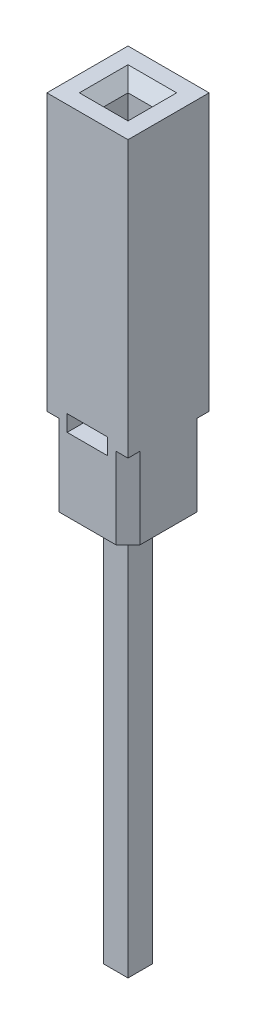
ISO-10303-21;
HEADER;
FILE_DESCRIPTION(('STEP AP214'),'2;1');
FILE_NAME('part.step','',(''),(''),'','','');
FILE_SCHEMA(('AUTOMOTIVE_DESIGN { 1 0 10303 214 1 1 1 1 }'));
ENDSEC;
DATA;
#1=APPLICATION_CONTEXT('core data for automotive mechanical design processes');
#2=APPLICATION_PROTOCOL_DEFINITION('international standard','automotive_design',2000,#1);
#3=PRODUCT_CONTEXT('',#1,'mechanical');
#4=PRODUCT('Part','Part','',(#3));
#5=PRODUCT_RELATED_PRODUCT_CATEGORY('part','',(#4));
#6=PRODUCT_DEFINITION_FORMATION('','',#4);
#7=PRODUCT_DEFINITION_CONTEXT('part definition',#1,'design');
#8=PRODUCT_DEFINITION('design','',#6,#7);
#9=PRODUCT_DEFINITION_SHAPE('','',#8);
#10=(LENGTH_UNIT() NAMED_UNIT(*) SI_UNIT(.MILLI.,.METRE.));
#11=(NAMED_UNIT(*) PLANE_ANGLE_UNIT() SI_UNIT($,.RADIAN.));
#12=(NAMED_UNIT(*) SI_UNIT($,.STERADIAN.) SOLID_ANGLE_UNIT());
#13=UNCERTAINTY_MEASURE_WITH_UNIT(LENGTH_MEASURE(1.E-05),#10,'distance_accuracy_value','');
#14=(GEOMETRIC_REPRESENTATION_CONTEXT(3) GLOBAL_UNCERTAINTY_ASSIGNED_CONTEXT((#13)) GLOBAL_UNIT_ASSIGNED_CONTEXT((#10,
#11,#12)) REPRESENTATION_CONTEXT('',''));
#15=CARTESIAN_POINT('',(0.,0.,0.));
#16=DIRECTION('',(0.,0.,1.));
#17=DIRECTION('',(1.,0.,0.));
#18=AXIS2_PLACEMENT_3D('',#15,#16,#17);
#19=CARTESIAN_POINT('',(0.,-0.254,0.));
#20=DIRECTION('',(0.,-1.,0.));
#21=DIRECTION('',(0.,0.,-1.));
#22=AXIS2_PLACEMENT_3D('',#19,#20,#21);
#23=PLANE('',#22);
#24=DIRECTION('',(0.,0.,1.));
#25=VECTOR('',#24,1.);
#26=CARTESIAN_POINT('',(0.381,-0.254,0.381));
#27=LINE('',#26,#25);
#28=CARTESIAN_POINT('',(0.381,-0.254,-0.381));
#29=VERTEX_POINT('',#28);
#30=CARTESIAN_POINT('',(0.381,-0.254,0.381));
#31=VERTEX_POINT('',#30);
#32=EDGE_CURVE('E327',#29,#31,#27,.T.);
#33=ORIENTED_EDGE('',*,*,#32,.F.);
#34=CARTESIAN_POINT('',(0.,-0.254,0.));
#35=DIRECTION('',(0.,-1.,0.));
#36=DIRECTION('',(0.,0.,-1.));
#37=AXIS2_PLACEMENT_3D('',#34,#35,#36);
#38=CIRCLE('',#37,0.538815367264149);
#39=EDGE_CURVE('E349',#29,#31,#38,.T.);
#40=ORIENTED_EDGE('',*,*,#39,.T.);
#41=EDGE_LOOP('',(#33,#40));
#42=FACE_BOUND('',#41,.T.);
#43=ADVANCED_FACE('F32',(#42),#23,.T.);
#44=DIRECTION('',(1.,0.,0.));
#45=VECTOR('',#44,1.);
#46=CARTESIAN_POINT('',(0.381,-0.254,-0.381));
#47=LINE('',#46,#45);
#48=CARTESIAN_POINT('',(-0.381,-0.254,-0.381));
#49=VERTEX_POINT('',#48);
#50=EDGE_CURVE('E337',#49,#29,#47,.T.);
#51=ORIENTED_EDGE('',*,*,#50,.F.);
#52=EDGE_CURVE('E348',#49,#29,#38,.T.);
#53=ORIENTED_EDGE('',*,*,#52,.T.);
#54=EDGE_LOOP('',(#51,#53));
#55=FACE_BOUND('',#54,.T.);
#56=ADVANCED_FACE('F517',(#55),#23,.T.);
#57=DIRECTION('',(0.,0.,-1.));
#58=VECTOR('',#57,1.);
#59=CARTESIAN_POINT('',(-0.381,-0.254,-0.381));
#60=LINE('',#59,#58);
#61=CARTESIAN_POINT('',(-0.381,-0.254,0.381));
#62=VERTEX_POINT('',#61);
#63=EDGE_CURVE('E334',#62,#49,#60,.T.);
#64=ORIENTED_EDGE('',*,*,#63,.F.);
#65=EDGE_CURVE('E554',#62,#49,#38,.T.);
#66=ORIENTED_EDGE('',*,*,#65,.T.);
#67=EDGE_LOOP('',(#64,#66));
#68=FACE_BOUND('',#67,.T.);
#69=ADVANCED_FACE('F524',(#68),#23,.T.);
#70=CARTESIAN_POINT('',(0.635,2.794,-1.27));
#71=DIRECTION('',(0.,-1.,0.));
#72=DIRECTION('',(0.,0.,-1.));
#73=AXIS2_PLACEMENT_3D('',#70,#71,#72);
#74=PLANE('',#73);
#75=DIRECTION('',(0.,0.,1.));
#76=VECTOR('',#75,1.);
#77=CARTESIAN_POINT('',(-0.635,2.794,1.27));
#78=LINE('',#77,#76);
#79=CARTESIAN_POINT('',(-0.635,2.794,-1.27));
#80=VERTEX_POINT('',#79);
#81=CARTESIAN_POINT('',(-0.635,2.794,1.27));
#82=VERTEX_POINT('',#81);
#83=EDGE_CURVE('E422',#80,#82,#78,.T.);
#84=ORIENTED_EDGE('',*,*,#83,.F.);
#85=DIRECTION('',(-1.,0.,0.));
#86=VECTOR('',#85,1.);
#87=CARTESIAN_POINT('',(0.635,2.794,-1.27));
#88=LINE('',#87,#86);
#89=CARTESIAN_POINT('',(0.635000000000002,2.794,-1.27));
#90=VERTEX_POINT('',#89);
#91=EDGE_CURVE('E783',#90,#80,#88,.T.);
#92=ORIENTED_EDGE('',*,*,#91,.F.);
#93=DIRECTION('',(0.,0.,1.));
#94=VECTOR('',#93,1.);
#95=CARTESIAN_POINT('',(0.635,2.794,-1.27));
#96=LINE('',#95,#94);
#97=CARTESIAN_POINT('',(0.635000000000002,2.794,1.27));
#98=VERTEX_POINT('',#97);
#99=EDGE_CURVE('E804',#90,#98,#96,.T.);
#100=ORIENTED_EDGE('',*,*,#99,.T.);
#101=DIRECTION('',(-1.,0.,0.));
#102=VECTOR('',#101,1.);
#103=CARTESIAN_POINT('',(0.635,2.794,1.27));
#104=LINE('',#103,#102);
#105=EDGE_CURVE('E781',#98,#82,#104,.T.);
#106=ORIENTED_EDGE('',*,*,#105,.T.);
#107=EDGE_LOOP('',(#84,#92,#100,#106));
#108=FACE_BOUND('',#107,.T.);
#109=DIRECTION('',(-1.,0.,0.));
#110=VECTOR('',#109,1.);
#111=CARTESIAN_POINT('',(-0.381,2.794,0.381));
#112=LINE('',#111,#110);
#113=CARTESIAN_POINT('',(0.381,2.794,0.381));
#114=VERTEX_POINT('',#113);
#115=CARTESIAN_POINT('',(-0.381,2.794,0.381));
#116=VERTEX_POINT('',#115);
#117=EDGE_CURVE('E407',#114,#116,#112,.T.);
#118=ORIENTED_EDGE('',*,*,#117,.F.);
#119=DIRECTION('',(0.,0.,1.));
#120=VECTOR('',#119,1.);
#121=CARTESIAN_POINT('',(0.381,2.794,0.381));
#122=LINE('',#121,#120);
#123=CARTESIAN_POINT('',(0.381,2.794,-0.381));
#124=VERTEX_POINT('',#123);
#125=EDGE_CURVE('E380',#124,#114,#122,.T.);
#126=ORIENTED_EDGE('',*,*,#125,.F.);
#127=DIRECTION('',(1.,0.,0.));
#128=VECTOR('',#127,1.);
#129=CARTESIAN_POINT('',(0.381,2.794,-0.381));
#130=LINE('',#129,#128);
#131=CARTESIAN_POINT('',(-0.381,2.794,-0.381));
#132=VERTEX_POINT('',#131);
#133=EDGE_CURVE('E395',#132,#124,#130,.T.);
#134=ORIENTED_EDGE('',*,*,#133,.F.);
#135=DIRECTION('',(0.,0.,-1.));
#136=VECTOR('',#135,1.);
#137=CARTESIAN_POINT('',(-0.381,2.794,-0.381));
#138=LINE('',#137,#136);
#139=EDGE_CURVE('E409',#116,#132,#138,.T.);
#140=ORIENTED_EDGE('',*,*,#139,.F.);
#141=EDGE_LOOP('',(#118,#126,#134,#140));
#142=FACE_BOUND('',#141,.T.);
#143=ADVANCED_FACE('F543',(#108,#142),#74,.T.);
#144=CARTESIAN_POINT('',(0.635,11.176,-1.27));
#145=DIRECTION('',(0.,0.,-1.));
#146=DIRECTION('',(0.,1.,0.));
#147=AXIS2_PLACEMENT_3D('',#144,#145,#146);
#148=PLANE('',#147);
#149=DIRECTION('',(0.,-1.,0.));
#150=VECTOR('',#149,1.);
#151=CARTESIAN_POINT('',(0.888999999999993,2.54,-1.27));
#152=LINE('',#151,#150);
#153=CARTESIAN_POINT('',(0.888999999999993,2.54,-1.27));
#154=VERTEX_POINT('',#153);
#155=CARTESIAN_POINT('',(0.888999999999993,0.,-1.27));
#156=VERTEX_POINT('',#155);
#157=EDGE_CURVE('E282',#154,#156,#152,.T.);
#158=ORIENTED_EDGE('',*,*,#157,.T.);
#159=DIRECTION('',(1.,0.,0.));
#160=VECTOR('',#159,1.);
#161=CARTESIAN_POINT('',(0.635000000000002,0.,-1.27));
#162=LINE('',#161,#160);
#163=CARTESIAN_POINT('',(-0.889000000000007,0.,-1.27));
#164=VERTEX_POINT('',#163);
#165=EDGE_CURVE('E377',#164,#156,#162,.T.);
#166=ORIENTED_EDGE('',*,*,#165,.F.);
#167=DIRECTION('',(0.,-1.,0.));
#168=VECTOR('',#167,1.);
#169=CARTESIAN_POINT('',(-0.889000000000007,2.54,-1.27));
#170=LINE('',#169,#168);
#171=CARTESIAN_POINT('',(-0.889000000000007,2.54,-1.27));
#172=VERTEX_POINT('',#171);
#173=EDGE_CURVE('E307',#172,#164,#170,.T.);
#174=ORIENTED_EDGE('',*,*,#173,.F.);
#175=DIRECTION('',(1.,0.,0.));
#176=VECTOR('',#175,1.);
#177=CARTESIAN_POINT('',(-1.27,2.54,-1.27));
#178=LINE('',#177,#176);
#179=CARTESIAN_POINT('',(-1.27,2.54,-1.27));
#180=VERTEX_POINT('',#179);
#181=EDGE_CURVE('E302',#180,#172,#178,.T.);
#182=ORIENTED_EDGE('',*,*,#181,.F.);
#183=DIRECTION('',(0.,-1.,0.));
#184=VECTOR('',#183,1.);
#185=CARTESIAN_POINT('',(-1.27,11.176,-1.27));
#186=LINE('',#185,#184);
#187=CARTESIAN_POINT('',(-1.27,11.176,-1.27));
#188=VERTEX_POINT('',#187);
#189=EDGE_CURVE('E773',#188,#180,#186,.T.);
#190=ORIENTED_EDGE('',*,*,#189,.F.);
#191=DIRECTION('',(-1.,0.,0.));
#192=VECTOR('',#191,1.);
#193=CARTESIAN_POINT('',(0.635,11.176,-1.27));
#194=LINE('',#193,#192);
#195=CARTESIAN_POINT('',(1.27,11.176,-1.27));
#196=VERTEX_POINT('',#195);
#197=EDGE_CURVE('E439',#196,#188,#194,.T.);
#198=ORIENTED_EDGE('',*,*,#197,.F.);
#199=DIRECTION('',(0.,1.,0.));
#200=VECTOR('',#199,1.);
#201=CARTESIAN_POINT('',(1.27,11.176,-1.27));
#202=LINE('',#201,#200);
#203=CARTESIAN_POINT('',(1.27,2.54,-1.27));
#204=VERTEX_POINT('',#203);
#205=EDGE_CURVE('E354',#204,#196,#202,.T.);
#206=ORIENTED_EDGE('',*,*,#205,.F.);
#207=DIRECTION('',(1.,0.,0.));
#208=VECTOR('',#207,1.);
#209=CARTESIAN_POINT('',(0.888999999999993,2.54,-1.27));
#210=LINE('',#209,#208);
#211=EDGE_CURVE('E273',#154,#204,#210,.T.);
#212=ORIENTED_EDGE('',*,*,#211,.F.);
#213=EDGE_LOOP('',(#158,#166,#174,#182,#190,#198,#206,#212));
#214=FACE_BOUND('',#213,.T.);
#215=DIRECTION('',(0.,1.,0.));
#216=VECTOR('',#215,1.);
#217=CARTESIAN_POINT('',(0.635000000000002,11.176,-1.27));
#218=LINE('',#217,#216);
#219=CARTESIAN_POINT('',(0.635000000000002,2.286,-1.27));
#220=VERTEX_POINT('',#219);
#221=EDGE_CURVE('E352',#220,#90,#218,.T.);
#222=ORIENTED_EDGE('',*,*,#221,.T.);
#223=ORIENTED_EDGE('',*,*,#91,.T.);
#224=DIRECTION('',(0.,1.,0.));
#225=VECTOR('',#224,1.);
#226=CARTESIAN_POINT('',(-0.635,2.286,-1.27));
#227=LINE('',#226,#225);
#228=CARTESIAN_POINT('',(-0.635,2.286,-1.27));
#229=VERTEX_POINT('',#228);
#230=EDGE_CURVE('E796',#229,#80,#227,.T.);
#231=ORIENTED_EDGE('',*,*,#230,.F.);
#232=DIRECTION('',(1.,0.,0.));
#233=VECTOR('',#232,1.);
#234=CARTESIAN_POINT('',(0.635000000000002,2.286,-1.27));
#235=LINE('',#234,#233);
#236=EDGE_CURVE('E388',#229,#220,#235,.T.);
#237=ORIENTED_EDGE('',*,*,#236,.T.);
#238=EDGE_LOOP('',(#222,#223,#231,#237));
#239=FACE_BOUND('',#238,.T.);
#240=ADVANCED_FACE('F548',(#214,#239),#148,.T.);
#241=CARTESIAN_POINT('',(0.635,11.176,1.27));
#242=DIRECTION('',(0.,1.,0.));
#243=DIRECTION('',(0.,0.,1.));
#244=AXIS2_PLACEMENT_3D('',#241,#242,#243);
#245=PLANE('',#244);
#246=DIRECTION('',(-1.,0.,0.));
#247=VECTOR('',#246,1.);
#248=CARTESIAN_POINT('',(-0.381,11.176,0.762000000000003));
#249=LINE('',#248,#247);
#250=CARTESIAN_POINT('',(0.762000000000003,11.176,0.762000000000003));
#251=VERTEX_POINT('',#250);
#252=CARTESIAN_POINT('',(-0.762000000000003,11.176,0.762000000000003));
#253=VERTEX_POINT('',#252);
#254=EDGE_CURVE('E468',#251,#253,#249,.T.);
#255=ORIENTED_EDGE('',*,*,#254,.T.);
#256=DIRECTION('',(0.,0.,-1.));
#257=VECTOR('',#256,1.);
#258=CARTESIAN_POINT('',(-0.762000000000003,11.176,-0.381));
#259=LINE('',#258,#257);
#260=CARTESIAN_POINT('',(-0.762000000000003,11.176,-0.762000000000003));
#261=VERTEX_POINT('',#260);
#262=EDGE_CURVE('E472',#253,#261,#259,.T.);
#263=ORIENTED_EDGE('',*,*,#262,.T.);
#264=DIRECTION('',(1.,0.,0.));
#265=VECTOR('',#264,1.);
#266=CARTESIAN_POINT('',(0.381,11.176,-0.762000000000003));
#267=LINE('',#266,#265);
#268=CARTESIAN_POINT('',(0.762000000000003,11.176,-0.762000000000003));
#269=VERTEX_POINT('',#268);
#270=EDGE_CURVE('E470',#261,#269,#267,.T.);
#271=ORIENTED_EDGE('',*,*,#270,.T.);
#272=DIRECTION('',(0.,0.,1.));
#273=VECTOR('',#272,1.);
#274=CARTESIAN_POINT('',(0.762000000000003,11.176,0.381));
#275=LINE('',#274,#273);
#276=EDGE_CURVE('E466',#269,#251,#275,.T.);
#277=ORIENTED_EDGE('',*,*,#276,.T.);
#278=EDGE_LOOP('',(#255,#263,#271,#277));
#279=FACE_BOUND('',#278,.T.);
#280=DIRECTION('',(0.,0.,-1.));
#281=VECTOR('',#280,1.);
#282=CARTESIAN_POINT('',(-1.27,11.176,1.27));
#283=LINE('',#282,#281);
#284=CARTESIAN_POINT('',(-1.27,11.176,1.27));
#285=VERTEX_POINT('',#284);
#286=EDGE_CURVE('E779',#285,#188,#283,.T.);
#287=ORIENTED_EDGE('',*,*,#286,.F.);
#288=DIRECTION('',(-1.,0.,0.));
#289=VECTOR('',#288,1.);
#290=CARTESIAN_POINT('',(0.635,11.176,1.27));
#291=LINE('',#290,#289);
#292=CARTESIAN_POINT('',(1.27,11.176,1.27));
#293=VERTEX_POINT('',#292);
#294=EDGE_CURVE('E776',#293,#285,#291,.T.);
#295=ORIENTED_EDGE('',*,*,#294,.F.);
#296=DIRECTION('',(0.,0.,1.));
#297=VECTOR('',#296,1.);
#298=CARTESIAN_POINT('',(1.27,11.176,1.27));
#299=LINE('',#298,#297);
#300=EDGE_CURVE('E356',#196,#293,#299,.T.);
#301=ORIENTED_EDGE('',*,*,#300,.F.);
#302=ORIENTED_EDGE('',*,*,#197,.T.);
#303=EDGE_LOOP('',(#287,#295,#301,#302));
#304=FACE_BOUND('',#303,.T.);
#305=ADVANCED_FACE('F496',(#279,#304),#245,.T.);
#306=CARTESIAN_POINT('',(0.635,2.794,1.27));
#307=DIRECTION('',(0.,0.,1.));
#308=DIRECTION('',(1.,0.,0.));
#309=AXIS2_PLACEMENT_3D('',#306,#307,#308);
#310=PLANE('',#309);
#311=DIRECTION('',(0.,-1.,0.));
#312=VECTOR('',#311,1.);
#313=CARTESIAN_POINT('',(0.889000000000002,2.54,1.27));
#314=LINE('',#313,#312);
#315=CARTESIAN_POINT('',(0.889000000000002,2.54,1.27));
#316=VERTEX_POINT('',#315);
#317=CARTESIAN_POINT('',(0.889000000000002,0.,1.27));
#318=VERTEX_POINT('',#317);
#319=EDGE_CURVE('E293',#316,#318,#314,.T.);
#320=ORIENTED_EDGE('',*,*,#319,.F.);
#321=DIRECTION('',(-1.,0.,0.));
#322=VECTOR('',#321,1.);
#323=CARTESIAN_POINT('',(1.27,2.54,1.27));
#324=LINE('',#323,#322);
#325=CARTESIAN_POINT('',(1.27,2.54,1.27));
#326=VERTEX_POINT('',#325);
#327=EDGE_CURVE('E289',#326,#316,#324,.T.);
#328=ORIENTED_EDGE('',*,*,#327,.F.);
#329=DIRECTION('',(0.,-1.,0.));
#330=VECTOR('',#329,1.);
#331=CARTESIAN_POINT('',(1.27,0.,1.27));
#332=LINE('',#331,#330);
#333=EDGE_CURVE('E360',#293,#326,#332,.T.);
#334=ORIENTED_EDGE('',*,*,#333,.F.);
#335=ORIENTED_EDGE('',*,*,#294,.T.);
#336=DIRECTION('',(0.,1.,0.));
#337=VECTOR('',#336,1.);
#338=CARTESIAN_POINT('',(-1.27,2.794,1.27));
#339=LINE('',#338,#337);
#340=CARTESIAN_POINT('',(-1.27,2.54,1.27));
#341=VERTEX_POINT('',#340);
#342=EDGE_CURVE('E800',#341,#285,#339,.T.);
#343=ORIENTED_EDGE('',*,*,#342,.F.);
#344=DIRECTION('',(-1.,0.,0.));
#345=VECTOR('',#344,1.);
#346=CARTESIAN_POINT('',(-0.889,2.54,1.27));
#347=LINE('',#346,#345);
#348=CARTESIAN_POINT('',(-0.889,2.54,1.27));
#349=VERTEX_POINT('',#348);
#350=EDGE_CURVE('E314',#349,#341,#347,.T.);
#351=ORIENTED_EDGE('',*,*,#350,.F.);
#352=DIRECTION('',(0.,-1.,0.));
#353=VECTOR('',#352,1.);
#354=CARTESIAN_POINT('',(-0.889,2.54,1.27));
#355=LINE('',#354,#353);
#356=CARTESIAN_POINT('',(-0.889,0.,1.27));
#357=VERTEX_POINT('',#356);
#358=EDGE_CURVE('E324',#349,#357,#355,.T.);
#359=ORIENTED_EDGE('',*,*,#358,.T.);
#360=DIRECTION('',(-1.,0.,0.));
#361=VECTOR('',#360,1.);
#362=CARTESIAN_POINT('',(-1.27,0.,1.27));
#363=LINE('',#362,#361);
#364=EDGE_CURVE('E371',#318,#357,#363,.T.);
#365=ORIENTED_EDGE('',*,*,#364,.F.);
#366=EDGE_LOOP('',(#320,#328,#334,#335,#343,#351,#359,#365));
#367=FACE_BOUND('',#366,.T.);
#368=ORIENTED_EDGE('',*,*,#105,.F.);
#369=DIRECTION('',(0.,-1.,0.));
#370=VECTOR('',#369,1.);
#371=CARTESIAN_POINT('',(0.635000000000002,0.,1.27));
#372=LINE('',#371,#370);
#373=CARTESIAN_POINT('',(0.635000000000002,2.286,1.27));
#374=VERTEX_POINT('',#373);
#375=EDGE_CURVE('E357',#98,#374,#372,.T.);
#376=ORIENTED_EDGE('',*,*,#375,.T.);
#377=DIRECTION('',(-1.,0.,0.));
#378=VECTOR('',#377,1.);
#379=CARTESIAN_POINT('',(-1.27,2.286,1.27));
#380=LINE('',#379,#378);
#381=CARTESIAN_POINT('',(-0.635,2.286,1.27));
#382=VERTEX_POINT('',#381);
#383=EDGE_CURVE('E366',#374,#382,#380,.T.);
#384=ORIENTED_EDGE('',*,*,#383,.T.);
#385=DIRECTION('',(0.,1.,0.));
#386=VECTOR('',#385,1.);
#387=CARTESIAN_POINT('',(-0.635,2.286,1.27));
#388=LINE('',#387,#386);
#389=EDGE_CURVE('E432',#382,#82,#388,.T.);
#390=ORIENTED_EDGE('',*,*,#389,.T.);
#391=EDGE_LOOP('',(#368,#376,#384,#390));
#392=FACE_BOUND('',#391,.T.);
#393=ADVANCED_FACE('F705',(#367,#392),#310,.T.);
#394=CARTESIAN_POINT('',(-1.27,0.,0.));
#395=DIRECTION('',(-1.,0.,0.));
#396=DIRECTION('',(0.,0.,1.));
#397=AXIS2_PLACEMENT_3D('',#394,#395,#396);
#398=PLANE('',#397);
#399=DIRECTION('',(0.,-1.,0.));
#400=VECTOR('',#399,1.);
#401=CARTESIAN_POINT('',(-1.27,2.54,-0.888999999999987));
#402=LINE('',#401,#400);
#403=CARTESIAN_POINT('',(-1.27,2.54,-0.888999999999987));
#404=VERTEX_POINT('',#403);
#405=CARTESIAN_POINT('',(-1.27,0.,-0.888999999999987));
#406=VERTEX_POINT('',#405);
#407=EDGE_CURVE('E309',#404,#406,#402,.T.);
#408=ORIENTED_EDGE('',*,*,#407,.T.);
#409=DIRECTION('',(0.,0.,-1.));
#410=VECTOR('',#409,1.);
#411=CARTESIAN_POINT('',(-1.27,0.,-1.27));
#412=LINE('',#411,#410);
#413=CARTESIAN_POINT('',(-1.27,0.,0.889));
#414=VERTEX_POINT('',#413);
#415=EDGE_CURVE('E373',#414,#406,#412,.T.);
#416=ORIENTED_EDGE('',*,*,#415,.F.);
#417=DIRECTION('',(0.,-1.,0.));
#418=VECTOR('',#417,1.);
#419=CARTESIAN_POINT('',(-1.27,2.54,0.889));
#420=LINE('',#419,#418);
#421=CARTESIAN_POINT('',(-1.27,2.54,0.889));
#422=VERTEX_POINT('',#421);
#423=EDGE_CURVE('E321',#422,#414,#420,.T.);
#424=ORIENTED_EDGE('',*,*,#423,.F.);
#425=DIRECTION('',(0.,0.,-1.));
#426=VECTOR('',#425,1.);
#427=CARTESIAN_POINT('',(-1.27,2.54,1.27));
#428=LINE('',#427,#426);
#429=EDGE_CURVE('E316',#341,#422,#428,.T.);
#430=ORIENTED_EDGE('',*,*,#429,.F.);
#431=ORIENTED_EDGE('',*,*,#342,.T.);
#432=ORIENTED_EDGE('',*,*,#286,.T.);
#433=ORIENTED_EDGE('',*,*,#189,.T.);
#434=DIRECTION('',(0.,0.,-1.));
#435=VECTOR('',#434,1.);
#436=CARTESIAN_POINT('',(-1.27,2.54,-0.888999999999987));
#437=LINE('',#436,#435);
#438=EDGE_CURVE('E300',#404,#180,#437,.T.);
#439=ORIENTED_EDGE('',*,*,#438,.F.);
#440=EDGE_LOOP('',(#408,#416,#424,#430,#431,#432,#433,#439));
#441=FACE_BOUND('',#440,.T.);
#442=ADVANCED_FACE('F708',(#441),#398,.T.);
#443=CARTESIAN_POINT('',(-0.635,2.286,1.27));
#444=DIRECTION('',(-1.,0.,0.));
#445=DIRECTION('',(0.,0.,1.));
#446=AXIS2_PLACEMENT_3D('',#443,#444,#445);
#447=PLANE('',#446);
#448=ORIENTED_EDGE('',*,*,#83,.T.);
#449=ORIENTED_EDGE('',*,*,#389,.F.);
#450=DIRECTION('',(0.,0.,1.));
#451=VECTOR('',#450,1.);
#452=CARTESIAN_POINT('',(-0.635,2.286,1.27));
#453=LINE('',#452,#451);
#454=EDGE_CURVE('E428',#229,#382,#453,.T.);
#455=ORIENTED_EDGE('',*,*,#454,.F.);
#456=ORIENTED_EDGE('',*,*,#230,.T.);
#457=EDGE_LOOP('',(#448,#449,#455,#456));
#458=FACE_BOUND('',#457,.T.);
#459=ADVANCED_FACE('F714',(#458),#447,.F.);
#460=CARTESIAN_POINT('',(0.381,2.286,0.381));
#461=DIRECTION('',(-1.,0.,0.));
#462=DIRECTION('',(0.,0.,1.));
#463=AXIS2_PLACEMENT_3D('',#460,#461,#462);
#464=PLANE('',#463);
#465=ORIENTED_EDGE('',*,*,#125,.T.);
#466=DIRECTION('',(0.,1.,0.));
#467=VECTOR('',#466,1.);
#468=CARTESIAN_POINT('',(0.381,2.286,0.381));
#469=LINE('',#468,#467);
#470=CARTESIAN_POINT('',(0.381,2.286,0.381));
#471=VERTEX_POINT('',#470);
#472=EDGE_CURVE('E420',#471,#114,#469,.T.);
#473=ORIENTED_EDGE('',*,*,#472,.F.);
#474=DIRECTION('',(0.,0.,1.));
#475=VECTOR('',#474,1.);
#476=CARTESIAN_POINT('',(0.381,2.286,0.381));
#477=LINE('',#476,#475);
#478=CARTESIAN_POINT('',(0.381,2.286,-0.381));
#479=VERTEX_POINT('',#478);
#480=EDGE_CURVE('E391',#479,#471,#477,.T.);
#481=ORIENTED_EDGE('',*,*,#480,.F.);
#482=DIRECTION('',(0.,1.,0.));
#483=VECTOR('',#482,1.);
#484=CARTESIAN_POINT('',(0.381,2.286,-0.381));
#485=LINE('',#484,#483);
#486=EDGE_CURVE('E404',#479,#124,#485,.T.);
#487=ORIENTED_EDGE('',*,*,#486,.T.);
#488=EDGE_LOOP('',(#465,#473,#481,#487));
#489=FACE_BOUND('',#488,.T.);
#490=ADVANCED_FACE('F718',(#489),#464,.F.);
#491=CARTESIAN_POINT('',(-0.381,2.286,0.381));
#492=DIRECTION('',(0.,0.,-1.));
#493=DIRECTION('',(-1.,0.,0.));
#494=AXIS2_PLACEMENT_3D('',#491,#492,#493);
#495=PLANE('',#494);
#496=ORIENTED_EDGE('',*,*,#117,.T.);
#497=DIRECTION('',(0.,1.,0.));
#498=VECTOR('',#497,1.);
#499=CARTESIAN_POINT('',(-0.381,2.286,0.381));
#500=LINE('',#499,#498);
#501=CARTESIAN_POINT('',(-0.381,2.286,0.381));
#502=VERTEX_POINT('',#501);
#503=EDGE_CURVE('E417',#502,#116,#500,.T.);
#504=ORIENTED_EDGE('',*,*,#503,.F.);
#505=DIRECTION('',(-1.,0.,0.));
#506=VECTOR('',#505,1.);
#507=CARTESIAN_POINT('',(-0.381,2.286,0.381));
#508=LINE('',#507,#506);
#509=EDGE_CURVE('E394',#471,#502,#508,.T.);
#510=ORIENTED_EDGE('',*,*,#509,.F.);
#511=ORIENTED_EDGE('',*,*,#472,.T.);
#512=EDGE_LOOP('',(#496,#504,#510,#511));
#513=FACE_BOUND('',#512,.T.);
#514=ADVANCED_FACE('F722',(#513),#495,.F.);
#515=CARTESIAN_POINT('',(-0.381,2.286,-0.381));
#516=DIRECTION('',(1.,0.,0.));
#517=DIRECTION('',(0.,0.,-1.));
#518=AXIS2_PLACEMENT_3D('',#515,#516,#517);
#519=PLANE('',#518);
#520=ORIENTED_EDGE('',*,*,#139,.T.);
#521=DIRECTION('',(0.,1.,0.));
#522=VECTOR('',#521,1.);
#523=CARTESIAN_POINT('',(-0.381,2.286,-0.381));
#524=LINE('',#523,#522);
#525=CARTESIAN_POINT('',(-0.381,2.286,-0.381));
#526=VERTEX_POINT('',#525);
#527=EDGE_CURVE('E415',#526,#132,#524,.T.);
#528=ORIENTED_EDGE('',*,*,#527,.F.);
#529=DIRECTION('',(0.,0.,-1.));
#530=VECTOR('',#529,1.);
#531=CARTESIAN_POINT('',(-0.381,2.286,-0.381));
#532=LINE('',#531,#530);
#533=EDGE_CURVE('E398',#502,#526,#532,.T.);
#534=ORIENTED_EDGE('',*,*,#533,.F.);
#535=ORIENTED_EDGE('',*,*,#503,.T.);
#536=EDGE_LOOP('',(#520,#528,#534,#535));
#537=FACE_BOUND('',#536,.T.);
#538=ADVANCED_FACE('F726',(#537),#519,.F.);
#539=CARTESIAN_POINT('',(0.381,2.286,-0.381));
#540=DIRECTION('',(0.,0.,1.));
#541=DIRECTION('',(1.,0.,0.));
#542=AXIS2_PLACEMENT_3D('',#539,#540,#541);
#543=PLANE('',#542);
#544=ORIENTED_EDGE('',*,*,#133,.T.);
#545=ORIENTED_EDGE('',*,*,#486,.F.);
#546=DIRECTION('',(1.,0.,0.));
#547=VECTOR('',#546,1.);
#548=CARTESIAN_POINT('',(0.381,2.286,-0.381));
#549=LINE('',#548,#547);
#550=EDGE_CURVE('E401',#526,#479,#549,.T.);
#551=ORIENTED_EDGE('',*,*,#550,.F.);
#552=ORIENTED_EDGE('',*,*,#527,.T.);
#553=EDGE_LOOP('',(#544,#545,#551,#552));
#554=FACE_BOUND('',#553,.T.);
#555=ADVANCED_FACE('F730',(#554),#543,.F.);
#556=CARTESIAN_POINT('',(0.,2.286,0.));
#557=DIRECTION('',(0.,1.,0.));
#558=DIRECTION('',(0.,0.,1.));
#559=AXIS2_PLACEMENT_3D('',#556,#557,#558);
#560=PLANE('',#559);
#561=ORIENTED_EDGE('',*,*,#236,.F.);
#562=ORIENTED_EDGE('',*,*,#454,.T.);
#563=ORIENTED_EDGE('',*,*,#383,.F.);
#564=DIRECTION('',(0.,0.,1.));
#565=VECTOR('',#564,1.);
#566=CARTESIAN_POINT('',(0.635000000000002,2.286,1.27));
#567=LINE('',#566,#565);
#568=EDGE_CURVE('E374',#220,#374,#567,.T.);
#569=ORIENTED_EDGE('',*,*,#568,.F.);
#570=EDGE_LOOP('',(#561,#562,#563,#569));
#571=FACE_BOUND('',#570,.T.);
#572=ORIENTED_EDGE('',*,*,#480,.T.);
#573=ORIENTED_EDGE('',*,*,#509,.T.);
#574=ORIENTED_EDGE('',*,*,#533,.T.);
#575=ORIENTED_EDGE('',*,*,#550,.T.);
#576=EDGE_LOOP('',(#572,#573,#574,#575));
#577=FACE_BOUND('',#576,.T.);
#578=ADVANCED_FACE('F734',(#571,#577),#560,.T.);
#579=CARTESIAN_POINT('',(0.,0.,0.));
#580=DIRECTION('',(0.,1.,0.));
#581=DIRECTION('',(0.,0.,1.));
#582=AXIS2_PLACEMENT_3D('',#579,#580,#581);
#583=PLANE('',#582);
#584=CARTESIAN_POINT('',(0.,0.,0.));
#585=DIRECTION('',(0.,1.,0.));
#586=DIRECTION('',(0.,0.,1.));
#587=AXIS2_PLACEMENT_3D('',#584,#585,#586);
#588=CIRCLE('',#587,0.538815367264149);
#589=CARTESIAN_POINT('',(0.,0.,0.538815367264149));
#590=VERTEX_POINT('',#589);
#591=EDGE_CURVE('E435',#590,#590,#588,.F.);
#592=ORIENTED_EDGE('',*,*,#591,.F.);
#593=EDGE_LOOP('',(#592));
#594=FACE_BOUND('',#593,.T.);
#595=ORIENTED_EDGE('',*,*,#165,.T.);
#596=DIRECTION('',(-0.707106781186556,0.,-0.707106781186539));
#597=VECTOR('',#596,1.);
#598=CARTESIAN_POINT('',(1.27,0.,-0.889000000000003));
#599=LINE('',#598,#597);
#600=CARTESIAN_POINT('',(1.27,0.,-0.889000000000003));
#601=VERTEX_POINT('',#600);
#602=EDGE_CURVE('E268',#601,#156,#599,.T.);
#603=ORIENTED_EDGE('',*,*,#602,.F.);
#604=DIRECTION('',(0.,0.,-1.));
#605=VECTOR('',#604,1.);
#606=CARTESIAN_POINT('',(1.27,0.,-1.27));
#607=LINE('',#606,#605);
#608=CARTESIAN_POINT('',(1.27,0.,0.888999999999997));
#609=VERTEX_POINT('',#608);
#610=EDGE_CURVE('E363',#609,#601,#607,.T.);
#611=ORIENTED_EDGE('',*,*,#610,.F.);
#612=DIRECTION('',(0.707106781186544,0.,-0.707106781186551));
#613=VECTOR('',#612,1.);
#614=CARTESIAN_POINT('',(0.889000000000002,0.,1.27));
#615=LINE('',#614,#613);
#616=EDGE_CURVE('E285',#318,#609,#615,.T.);
#617=ORIENTED_EDGE('',*,*,#616,.F.);
#618=ORIENTED_EDGE('',*,*,#364,.T.);
#619=DIRECTION('',(0.707106781186547,0.,0.707106781186547));
#620=VECTOR('',#619,1.);
#621=CARTESIAN_POINT('',(-1.27,0.,0.889));
#622=LINE('',#621,#620);
#623=EDGE_CURVE('E312',#414,#357,#622,.T.);
#624=ORIENTED_EDGE('',*,*,#623,.F.);
#625=ORIENTED_EDGE('',*,*,#415,.T.);
#626=DIRECTION('',(-0.70710678118653,0.,0.707106781186565));
#627=VECTOR('',#626,1.);
#628=CARTESIAN_POINT('',(-0.889000000000007,0.,-1.27));
#629=LINE('',#628,#627);
#630=EDGE_CURVE('E298',#164,#406,#629,.T.);
#631=ORIENTED_EDGE('',*,*,#630,.F.);
#632=EDGE_LOOP('',(#595,#603,#611,#617,#618,#624,#625,#631));
#633=FACE_BOUND('',#632,.T.);
#634=ADVANCED_FACE('F738',(#594,#633),#583,.F.);
#635=CARTESIAN_POINT('',(1.27,0.,0.));
#636=DIRECTION('',(-1.,0.,0.));
#637=DIRECTION('',(0.,0.,1.));
#638=AXIS2_PLACEMENT_3D('',#635,#636,#637);
#639=PLANE('',#638);
#640=ORIENTED_EDGE('',*,*,#610,.T.);
#641=DIRECTION('',(0.,-1.,0.));
#642=VECTOR('',#641,1.);
#643=CARTESIAN_POINT('',(1.27,2.54,-0.889000000000003));
#644=LINE('',#643,#642);
#645=CARTESIAN_POINT('',(1.27,2.54,-0.889000000000003));
#646=VERTEX_POINT('',#645);
#647=EDGE_CURVE('E280',#646,#601,#644,.T.);
#648=ORIENTED_EDGE('',*,*,#647,.F.);
#649=DIRECTION('',(0.,0.,1.));
#650=VECTOR('',#649,1.);
#651=CARTESIAN_POINT('',(1.27,2.54,-1.27));
#652=LINE('',#651,#650);
#653=EDGE_CURVE('E275',#204,#646,#652,.T.);
#654=ORIENTED_EDGE('',*,*,#653,.F.);
#655=ORIENTED_EDGE('',*,*,#205,.T.);
#656=ORIENTED_EDGE('',*,*,#300,.T.);
#657=ORIENTED_EDGE('',*,*,#333,.T.);
#658=DIRECTION('',(0.,0.,1.));
#659=VECTOR('',#658,1.);
#660=CARTESIAN_POINT('',(1.27,2.54,0.888999999999997));
#661=LINE('',#660,#659);
#662=CARTESIAN_POINT('',(1.27,2.54,0.888999999999997));
#663=VERTEX_POINT('',#662);
#664=EDGE_CURVE('E287',#663,#326,#661,.T.);
#665=ORIENTED_EDGE('',*,*,#664,.F.);
#666=DIRECTION('',(0.,-1.,0.));
#667=VECTOR('',#666,1.);
#668=CARTESIAN_POINT('',(1.27,2.54,0.888999999999997));
#669=LINE('',#668,#667);
#670=EDGE_CURVE('E295',#663,#609,#669,.T.);
#671=ORIENTED_EDGE('',*,*,#670,.T.);
#672=EDGE_LOOP('',(#640,#648,#654,#655,#656,#657,#665,#671));
#673=FACE_BOUND('',#672,.T.);
#674=ADVANCED_FACE('F742',(#673),#639,.F.);
#675=CARTESIAN_POINT('',(0.635000000000002,0.,0.));
#676=DIRECTION('',(-1.,0.,0.));
#677=DIRECTION('',(0.,0.,1.));
#678=AXIS2_PLACEMENT_3D('',#675,#676,#677);
#679=PLANE('',#678);
#680=ORIENTED_EDGE('',*,*,#375,.F.);
#681=ORIENTED_EDGE('',*,*,#99,.F.);
#682=ORIENTED_EDGE('',*,*,#221,.F.);
#683=ORIENTED_EDGE('',*,*,#568,.T.);
#684=EDGE_LOOP('',(#680,#681,#682,#683));
#685=FACE_BOUND('',#684,.T.);
#686=ADVANCED_FACE('F539',(#685),#679,.T.);
#687=CARTESIAN_POINT('',(0.,-0.254,0.));
#688=DIRECTION('',(0.,1.,0.));
#689=DIRECTION('',(0.,0.,1.));
#690=AXIS2_PLACEMENT_3D('',#687,#688,#689);
#691=CYLINDRICAL_SURFACE('',#690,0.538815367264149);
#692=ORIENTED_EDGE('',*,*,#39,.F.);
#693=ORIENTED_EDGE('',*,*,#52,.F.);
#694=ORIENTED_EDGE('',*,*,#65,.F.);
#695=EDGE_CURVE('E353',#31,#62,#38,.T.);
#696=ORIENTED_EDGE('',*,*,#695,.F.);
#697=EDGE_LOOP('',(#692,#693,#694,#696));
#698=FACE_BOUND('',#697,.T.);
#699=ORIENTED_EDGE('',*,*,#591,.T.);
#700=EDGE_LOOP('',(#699));
#701=FACE_BOUND('',#700,.T.);
#702=ADVANCED_FACE('F531',(#698,#701),#691,.T.);
#703=DIRECTION('',(-1.,0.,0.));
#704=VECTOR('',#703,1.);
#705=CARTESIAN_POINT('',(-0.381,-0.254,0.381));
#706=LINE('',#705,#704);
#707=EDGE_CURVE('E331',#31,#62,#706,.T.);
#708=ORIENTED_EDGE('',*,*,#707,.F.);
#709=ORIENTED_EDGE('',*,*,#695,.T.);
#710=EDGE_LOOP('',(#708,#709));
#711=FACE_BOUND('',#710,.T.);
#712=ADVANCED_FACE('F520',(#711),#23,.T.);
#713=CARTESIAN_POINT('',(0.381,-12.7,0.381));
#714=DIRECTION('',(-1.,0.,0.));
#715=DIRECTION('',(0.,0.,1.));
#716=AXIS2_PLACEMENT_3D('',#713,#714,#715);
#717=PLANE('',#716);
#718=DIRECTION('',(0.,1.,0.));
#719=VECTOR('',#718,1.);
#720=CARTESIAN_POINT('',(0.381,-12.7,0.381));
#721=LINE('',#720,#719);
#722=CARTESIAN_POINT('',(0.381,-12.446,0.381));
#723=VERTEX_POINT('',#722);
#724=EDGE_CURVE('E346',#723,#31,#721,.T.);
#725=ORIENTED_EDGE('',*,*,#724,.F.);
#726=DIRECTION('',(0.,0.,-1.));
#727=VECTOR('',#726,1.);
#728=CARTESIAN_POINT('',(0.381,-12.446,0.381));
#729=LINE('',#728,#727);
#730=CARTESIAN_POINT('',(0.381,-12.446,-0.381));
#731=VERTEX_POINT('',#730);
#732=EDGE_CURVE('E451',#723,#731,#729,.T.);
#733=ORIENTED_EDGE('',*,*,#732,.T.);
#734=DIRECTION('',(0.,1.,0.));
#735=VECTOR('',#734,1.);
#736=CARTESIAN_POINT('',(0.381,-12.7,-0.381));
#737=LINE('',#736,#735);
#738=EDGE_CURVE('E340',#731,#29,#737,.T.);
#739=ORIENTED_EDGE('',*,*,#738,.T.);
#740=ORIENTED_EDGE('',*,*,#32,.T.);
#741=EDGE_LOOP('',(#725,#733,#739,#740));
#742=FACE_BOUND('',#741,.T.);
#743=ADVANCED_FACE('F530',(#742),#717,.F.);
#744=CARTESIAN_POINT('',(-0.381,-12.7,0.381));
#745=DIRECTION('',(0.,0.,-1.));
#746=DIRECTION('',(-1.,0.,0.));
#747=AXIS2_PLACEMENT_3D('',#744,#745,#746);
#748=PLANE('',#747);
#749=DIRECTION('',(0.,1.,0.));
#750=VECTOR('',#749,1.);
#751=CARTESIAN_POINT('',(-0.381,-12.7,0.381));
#752=LINE('',#751,#750);
#753=CARTESIAN_POINT('',(-0.381,-12.446,0.381));
#754=VERTEX_POINT('',#753);
#755=EDGE_CURVE('E344',#754,#62,#752,.T.);
#756=ORIENTED_EDGE('',*,*,#755,.F.);
#757=DIRECTION('',(1.,0.,0.));
#758=VECTOR('',#757,1.);
#759=CARTESIAN_POINT('',(-0.381,-12.446,0.381));
#760=LINE('',#759,#758);
#761=EDGE_CURVE('E448',#754,#723,#760,.T.);
#762=ORIENTED_EDGE('',*,*,#761,.T.);
#763=ORIENTED_EDGE('',*,*,#724,.T.);
#764=ORIENTED_EDGE('',*,*,#707,.T.);
#765=EDGE_LOOP('',(#756,#762,#763,#764));
#766=FACE_BOUND('',#765,.T.);
#767=ADVANCED_FACE('F537',(#766),#748,.F.);
#768=CARTESIAN_POINT('',(-0.381,-12.7,-0.381));
#769=DIRECTION('',(1.,0.,0.));
#770=DIRECTION('',(0.,0.,-1.));
#771=AXIS2_PLACEMENT_3D('',#768,#769,#770);
#772=PLANE('',#771);
#773=DIRECTION('',(0.,1.,0.));
#774=VECTOR('',#773,1.);
#775=CARTESIAN_POINT('',(-0.381,-12.7,-0.381));
#776=LINE('',#775,#774);
#777=CARTESIAN_POINT('',(-0.381,-12.446,-0.381));
#778=VERTEX_POINT('',#777);
#779=EDGE_CURVE('E342',#778,#49,#776,.T.);
#780=ORIENTED_EDGE('',*,*,#779,.F.);
#781=DIRECTION('',(0.,0.,1.));
#782=VECTOR('',#781,1.);
#783=CARTESIAN_POINT('',(-0.381,-12.446,-0.381));
#784=LINE('',#783,#782);
#785=EDGE_CURVE('E453',#778,#754,#784,.T.);
#786=ORIENTED_EDGE('',*,*,#785,.T.);
#787=ORIENTED_EDGE('',*,*,#755,.T.);
#788=ORIENTED_EDGE('',*,*,#63,.T.);
#789=EDGE_LOOP('',(#780,#786,#787,#788));
#790=FACE_BOUND('',#789,.T.);
#791=ADVANCED_FACE('F590',(#790),#772,.F.);
#792=CARTESIAN_POINT('',(0.381,-12.7,-0.381));
#793=DIRECTION('',(0.,0.,1.));
#794=DIRECTION('',(1.,0.,0.));
#795=AXIS2_PLACEMENT_3D('',#792,#793,#794);
#796=PLANE('',#795);
#797=ORIENTED_EDGE('',*,*,#738,.F.);
#798=DIRECTION('',(-1.,0.,0.));
#799=VECTOR('',#798,1.);
#800=CARTESIAN_POINT('',(0.381,-12.446,-0.381));
#801=LINE('',#800,#799);
#802=EDGE_CURVE('E455',#731,#778,#801,.T.);
#803=ORIENTED_EDGE('',*,*,#802,.T.);
#804=ORIENTED_EDGE('',*,*,#779,.T.);
#805=ORIENTED_EDGE('',*,*,#50,.T.);
#806=EDGE_LOOP('',(#797,#803,#804,#805));
#807=FACE_BOUND('',#806,.T.);
#808=ADVANCED_FACE('F571',(#807),#796,.F.);
#809=CARTESIAN_POINT('',(0.,-12.7,0.));
#810=DIRECTION('',(0.,1.,0.));
#811=DIRECTION('',(0.,0.,1.));
#812=AXIS2_PLACEMENT_3D('',#809,#810,#811);
#813=PLANE('',#812);
#814=DIRECTION('',(0.,0.,1.));
#815=VECTOR('',#814,1.);
#816=CARTESIAN_POINT('',(0.127000000000003,-12.7,0.));
#817=LINE('',#816,#815);
#818=CARTESIAN_POINT('',(0.127000000000003,-12.7,-0.127000000000003));
#819=VERTEX_POINT('',#818);
#820=CARTESIAN_POINT('',(0.127000000000003,-12.7,0.127000000000003));
#821=VERTEX_POINT('',#820);
#822=EDGE_CURVE('E443',#819,#821,#817,.T.);
#823=ORIENTED_EDGE('',*,*,#822,.T.);
#824=DIRECTION('',(-1.,0.,0.));
#825=VECTOR('',#824,1.);
#826=CARTESIAN_POINT('',(0.,-12.7,0.127000000000003));
#827=LINE('',#826,#825);
#828=CARTESIAN_POINT('',(-0.127000000000003,-12.7,0.127000000000003));
#829=VERTEX_POINT('',#828);
#830=EDGE_CURVE('E445',#821,#829,#827,.T.);
#831=ORIENTED_EDGE('',*,*,#830,.T.);
#832=DIRECTION('',(0.,0.,-1.));
#833=VECTOR('',#832,1.);
#834=CARTESIAN_POINT('',(-0.127000000000003,-12.7,0.));
#835=LINE('',#834,#833);
#836=CARTESIAN_POINT('',(-0.127000000000003,-12.7,-0.127000000000003));
#837=VERTEX_POINT('',#836);
#838=EDGE_CURVE('E441',#829,#837,#835,.T.);
#839=ORIENTED_EDGE('',*,*,#838,.T.);
#840=DIRECTION('',(1.,0.,0.));
#841=VECTOR('',#840,1.);
#842=CARTESIAN_POINT('',(0.,-12.7,-0.127000000000003));
#843=LINE('',#842,#841);
#844=EDGE_CURVE('E438',#837,#819,#843,.T.);
#845=ORIENTED_EDGE('',*,*,#844,.T.);
#846=EDGE_LOOP('',(#823,#831,#839,#845));
#847=FACE_BOUND('',#846,.T.);
#848=ADVANCED_FACE('F585',(#847),#813,.F.);
#849=CARTESIAN_POINT('',(-1.27,2.54,0.889));
#850=DIRECTION('',(0.707106781186548,0.,-0.707106781186548));
#851=DIRECTION('',(-0.707106781186548,0.,-0.707106781186548));
#852=AXIS2_PLACEMENT_3D('',#849,#850,#851);
#853=PLANE('',#852);
#854=ORIENTED_EDGE('',*,*,#623,.T.);
#855=ORIENTED_EDGE('',*,*,#358,.F.);
#856=DIRECTION('',(0.707106781186547,0.,0.707106781186547));
#857=VECTOR('',#856,1.);
#858=CARTESIAN_POINT('',(-1.27,2.54,0.889));
#859=LINE('',#858,#857);
#860=EDGE_CURVE('E318',#422,#349,#859,.T.);
#861=ORIENTED_EDGE('',*,*,#860,.F.);
#862=ORIENTED_EDGE('',*,*,#423,.T.);
#863=EDGE_LOOP('',(#854,#855,#861,#862));
#864=FACE_BOUND('',#863,.T.);
#865=ADVANCED_FACE('F602',(#864),#853,.F.);
#866=CARTESIAN_POINT('',(0.,2.54,0.));
#867=DIRECTION('',(0.,-1.,0.));
#868=DIRECTION('',(0.,0.,-1.));
#869=AXIS2_PLACEMENT_3D('',#866,#867,#868);
#870=PLANE('',#869);
#871=ORIENTED_EDGE('',*,*,#350,.T.);
#872=ORIENTED_EDGE('',*,*,#429,.T.);
#873=ORIENTED_EDGE('',*,*,#860,.T.);
#874=EDGE_LOOP('',(#871,#872,#873));
#875=FACE_BOUND('',#874,.T.);
#876=ADVANCED_FACE('F605',(#875),#870,.T.);
#877=CARTESIAN_POINT('',(-0.889000000000007,2.54,-1.27));
#878=DIRECTION('',(0.707106781186565,0.,0.70710678118653));
#879=DIRECTION('',(0.70710678118653,0.,-0.707106781186565));
#880=AXIS2_PLACEMENT_3D('',#877,#878,#879);
#881=PLANE('',#880);
#882=ORIENTED_EDGE('',*,*,#630,.T.);
#883=ORIENTED_EDGE('',*,*,#407,.F.);
#884=DIRECTION('',(-0.70710678118653,0.,0.707106781186565));
#885=VECTOR('',#884,1.);
#886=CARTESIAN_POINT('',(-0.889000000000007,2.54,-1.27));
#887=LINE('',#886,#885);
#888=EDGE_CURVE('E304',#172,#404,#887,.T.);
#889=ORIENTED_EDGE('',*,*,#888,.F.);
#890=ORIENTED_EDGE('',*,*,#173,.T.);
#891=EDGE_LOOP('',(#882,#883,#889,#890));
#892=FACE_BOUND('',#891,.T.);
#893=ADVANCED_FACE('F609',(#892),#881,.F.);
#894=CARTESIAN_POINT('',(0.,2.54,0.));
#895=DIRECTION('',(0.,-1.,0.));
#896=DIRECTION('',(0.,0.,-1.));
#897=AXIS2_PLACEMENT_3D('',#894,#895,#896);
#898=PLANE('',#897);
#899=ORIENTED_EDGE('',*,*,#438,.T.);
#900=ORIENTED_EDGE('',*,*,#181,.T.);
#901=ORIENTED_EDGE('',*,*,#888,.T.);
#902=EDGE_LOOP('',(#899,#900,#901));
#903=FACE_BOUND('',#902,.T.);
#904=ADVANCED_FACE('F613',(#903),#898,.T.);
#905=CARTESIAN_POINT('',(0.889000000000002,2.54,1.27));
#906=DIRECTION('',(-0.707106781186551,0.,-0.707106781186544));
#907=DIRECTION('',(-0.707106781186544,0.,0.707106781186551));
#908=AXIS2_PLACEMENT_3D('',#905,#906,#907);
#909=PLANE('',#908);
#910=ORIENTED_EDGE('',*,*,#616,.T.);
#911=ORIENTED_EDGE('',*,*,#670,.F.);
#912=DIRECTION('',(0.707106781186544,0.,-0.707106781186551));
#913=VECTOR('',#912,1.);
#914=CARTESIAN_POINT('',(0.889000000000002,2.54,1.27));
#915=LINE('',#914,#913);
#916=EDGE_CURVE('E291',#316,#663,#915,.T.);
#917=ORIENTED_EDGE('',*,*,#916,.F.);
#918=ORIENTED_EDGE('',*,*,#319,.T.);
#919=EDGE_LOOP('',(#910,#911,#917,#918));
#920=FACE_BOUND('',#919,.T.);
#921=ADVANCED_FACE('F617',(#920),#909,.F.);
#922=CARTESIAN_POINT('',(0.,2.54,0.));
#923=DIRECTION('',(0.,-1.,0.));
#924=DIRECTION('',(0.,0.,-1.));
#925=AXIS2_PLACEMENT_3D('',#922,#923,#924);
#926=PLANE('',#925);
#927=ORIENTED_EDGE('',*,*,#664,.T.);
#928=ORIENTED_EDGE('',*,*,#327,.T.);
#929=ORIENTED_EDGE('',*,*,#916,.T.);
#930=EDGE_LOOP('',(#927,#928,#929));
#931=FACE_BOUND('',#930,.T.);
#932=ADVANCED_FACE('F621',(#931),#926,.T.);
#933=CARTESIAN_POINT('',(1.27,2.54,-0.889000000000003));
#934=DIRECTION('',(-0.707106781186539,0.,0.707106781186556));
#935=DIRECTION('',(0.707106781186556,0.,0.707106781186539));
#936=AXIS2_PLACEMENT_3D('',#933,#934,#935);
#937=PLANE('',#936);
#938=ORIENTED_EDGE('',*,*,#602,.T.);
#939=ORIENTED_EDGE('',*,*,#157,.F.);
#940=DIRECTION('',(-0.707106781186556,0.,-0.707106781186539));
#941=VECTOR('',#940,1.);
#942=CARTESIAN_POINT('',(1.27,2.54,-0.889000000000003));
#943=LINE('',#942,#941);
#944=EDGE_CURVE('E277',#646,#154,#943,.T.);
#945=ORIENTED_EDGE('',*,*,#944,.F.);
#946=ORIENTED_EDGE('',*,*,#647,.T.);
#947=EDGE_LOOP('',(#938,#939,#945,#946));
#948=FACE_BOUND('',#947,.T.);
#949=ADVANCED_FACE('F625',(#948),#937,.F.);
#950=CARTESIAN_POINT('',(0.,2.54,0.));
#951=DIRECTION('',(0.,-1.,0.));
#952=DIRECTION('',(0.,0.,-1.));
#953=AXIS2_PLACEMENT_3D('',#950,#951,#952);
#954=PLANE('',#953);
#955=ORIENTED_EDGE('',*,*,#211,.T.);
#956=ORIENTED_EDGE('',*,*,#653,.T.);
#957=ORIENTED_EDGE('',*,*,#944,.T.);
#958=EDGE_LOOP('',(#955,#956,#957));
#959=FACE_BOUND('',#958,.T.);
#960=ADVANCED_FACE('F629',(#959),#954,.T.);
#961=CARTESIAN_POINT('',(-0.381,3.556,0.381));
#962=DIRECTION('',(0.,0.,1.));
#963=DIRECTION('',(1.,0.,0.));
#964=AXIS2_PLACEMENT_3D('',#961,#962,#963);
#965=PLANE('',#964);
#966=DIRECTION('',(0.,1.,0.));
#967=VECTOR('',#966,1.);
#968=CARTESIAN_POINT('',(-0.381,3.556,0.381));
#969=LINE('',#968,#967);
#970=CARTESIAN_POINT('',(-0.381,3.556,0.381));
#971=VERTEX_POINT('',#970);
#972=CARTESIAN_POINT('',(-0.381,10.795,0.381));
#973=VERTEX_POINT('',#972);
#974=EDGE_CURVE('E266',#971,#973,#969,.T.);
#975=ORIENTED_EDGE('',*,*,#974,.T.);
#976=DIRECTION('',(1.,0.,0.));
#977=VECTOR('',#976,1.);
#978=CARTESIAN_POINT('',(0.381,10.795,0.381));
#979=LINE('',#978,#977);
#980=CARTESIAN_POINT('',(0.381,10.795,0.381));
#981=VERTEX_POINT('',#980);
#982=EDGE_CURVE('E41',#973,#981,#979,.T.);
#983=ORIENTED_EDGE('',*,*,#982,.T.);
#984=DIRECTION('',(0.,1.,0.));
#985=VECTOR('',#984,1.);
#986=CARTESIAN_POINT('',(0.381,3.556,0.381));
#987=LINE('',#986,#985);
#988=CARTESIAN_POINT('',(0.381,3.556,0.381));
#989=VERTEX_POINT('',#988);
#990=EDGE_CURVE('E239',#989,#981,#987,.T.);
#991=ORIENTED_EDGE('',*,*,#990,.F.);
#992=DIRECTION('',(1.,0.,0.));
#993=VECTOR('',#992,1.);
#994=CARTESIAN_POINT('',(-0.381,3.556,0.381));
#995=LINE('',#994,#993);
#996=EDGE_CURVE('E243',#971,#989,#995,.T.);
#997=ORIENTED_EDGE('',*,*,#996,.F.);
#998=EDGE_LOOP('',(#975,#983,#991,#997));
#999=FACE_BOUND('',#998,.T.);
#1000=ADVANCED_FACE('F241',(#999),#965,.F.);
#1001=CARTESIAN_POINT('',(-0.381,3.556,-0.381));
#1002=DIRECTION('',(-1.,0.,0.));
#1003=DIRECTION('',(0.,0.,1.));
#1004=AXIS2_PLACEMENT_3D('',#1001,#1002,#1003);
#1005=PLANE('',#1004);
#1006=DIRECTION('',(0.,1.,0.));
#1007=VECTOR('',#1006,1.);
#1008=CARTESIAN_POINT('',(-0.381,3.556,-0.381));
#1009=LINE('',#1008,#1007);
#1010=CARTESIAN_POINT('',(-0.381,3.556,-0.381));
#1011=VERTEX_POINT('',#1010);
#1012=CARTESIAN_POINT('',(-0.381,10.795,-0.381));
#1013=VERTEX_POINT('',#1012);
#1014=EDGE_CURVE('E269',#1011,#1013,#1009,.T.);
#1015=ORIENTED_EDGE('',*,*,#1014,.T.);
#1016=DIRECTION('',(0.,0.,1.));
#1017=VECTOR('',#1016,1.);
#1018=CARTESIAN_POINT('',(-0.381,10.795,0.381));
#1019=LINE('',#1018,#1017);
#1020=EDGE_CURVE('E457',#1013,#973,#1019,.T.);
#1021=ORIENTED_EDGE('',*,*,#1020,.T.);
#1022=ORIENTED_EDGE('',*,*,#974,.F.);
#1023=DIRECTION('',(0.,0.,1.));
#1024=VECTOR('',#1023,1.);
#1025=CARTESIAN_POINT('',(-0.381,3.556,-0.381));
#1026=LINE('',#1025,#1024);
#1027=EDGE_CURVE('E246',#1011,#971,#1026,.T.);
#1028=ORIENTED_EDGE('',*,*,#1027,.F.);
#1029=EDGE_LOOP('',(#1015,#1021,#1022,#1028));
#1030=FACE_BOUND('',#1029,.T.);
#1031=ADVANCED_FACE('F505',(#1030),#1005,.F.);
#1032=CARTESIAN_POINT('',(0.381,3.556,-0.381));
#1033=DIRECTION('',(0.,0.,-1.));
#1034=DIRECTION('',(-1.,0.,0.));
#1035=AXIS2_PLACEMENT_3D('',#1032,#1033,#1034);
#1036=PLANE('',#1035);
#1037=DIRECTION('',(0.,1.,0.));
#1038=VECTOR('',#1037,1.);
#1039=CARTESIAN_POINT('',(0.381,3.556,-0.381));
#1040=LINE('',#1039,#1038);
#1041=CARTESIAN_POINT('',(0.381,3.556,-0.381));
#1042=VERTEX_POINT('',#1041);
#1043=CARTESIAN_POINT('',(0.381,10.795,-0.381));
#1044=VERTEX_POINT('',#1043);
#1045=EDGE_CURVE('E245',#1042,#1044,#1040,.T.);
#1046=ORIENTED_EDGE('',*,*,#1045,.T.);
#1047=DIRECTION('',(-1.,0.,0.));
#1048=VECTOR('',#1047,1.);
#1049=CARTESIAN_POINT('',(-0.381,10.795,-0.381));
#1050=LINE('',#1049,#1048);
#1051=EDGE_CURVE('E475',#1044,#1013,#1050,.T.);
#1052=ORIENTED_EDGE('',*,*,#1051,.T.);
#1053=ORIENTED_EDGE('',*,*,#1014,.F.);
#1054=DIRECTION('',(-1.,0.,0.));
#1055=VECTOR('',#1054,1.);
#1056=CARTESIAN_POINT('',(0.381,3.556,-0.381));
#1057=LINE('',#1056,#1055);
#1058=EDGE_CURVE('E254',#1042,#1011,#1057,.T.);
#1059=ORIENTED_EDGE('',*,*,#1058,.F.);
#1060=EDGE_LOOP('',(#1046,#1052,#1053,#1059));
#1061=FACE_BOUND('',#1060,.T.);
#1062=ADVANCED_FACE('F507',(#1061),#1036,.F.);
#1063=CARTESIAN_POINT('',(0.381,3.556,0.381));
#1064=DIRECTION('',(1.,0.,0.));
#1065=DIRECTION('',(0.,0.,-1.));
#1066=AXIS2_PLACEMENT_3D('',#1063,#1064,#1065);
#1067=PLANE('',#1066);
#1068=ORIENTED_EDGE('',*,*,#990,.T.);
#1069=DIRECTION('',(0.,0.,-1.));
#1070=VECTOR('',#1069,1.);
#1071=CARTESIAN_POINT('',(0.381,10.795,-0.381));
#1072=LINE('',#1071,#1070);
#1073=EDGE_CURVE('E11',#981,#1044,#1072,.T.);
#1074=ORIENTED_EDGE('',*,*,#1073,.T.);
#1075=ORIENTED_EDGE('',*,*,#1045,.F.);
#1076=DIRECTION('',(0.,0.,-1.));
#1077=VECTOR('',#1076,1.);
#1078=CARTESIAN_POINT('',(0.381,3.556,0.381));
#1079=LINE('',#1078,#1077);
#1080=EDGE_CURVE('E249',#989,#1042,#1079,.T.);
#1081=ORIENTED_EDGE('',*,*,#1080,.F.);
#1082=EDGE_LOOP('',(#1068,#1074,#1075,#1081));
#1083=FACE_BOUND('',#1082,.T.);
#1084=ADVANCED_FACE('F250',(#1083),#1067,.F.);
#1085=CARTESIAN_POINT('',(0.,3.556,0.));
#1086=DIRECTION('',(0.,1.,0.));
#1087=DIRECTION('',(0.,0.,1.));
#1088=AXIS2_PLACEMENT_3D('',#1085,#1086,#1087);
#1089=PLANE('',#1088);
#1090=ORIENTED_EDGE('',*,*,#996,.T.);
#1091=ORIENTED_EDGE('',*,*,#1080,.T.);
#1092=ORIENTED_EDGE('',*,*,#1058,.T.);
#1093=ORIENTED_EDGE('',*,*,#1027,.T.);
#1094=EDGE_LOOP('',(#1090,#1091,#1092,#1093));
#1095=FACE_BOUND('',#1094,.T.);
#1096=ADVANCED_FACE('F256',(#1095),#1089,.T.);
#1097=CARTESIAN_POINT('',(0.,-12.7,-0.127000000000003));
#1098=DIRECTION('',(0.,0.707106781186552,0.707106781186543));
#1099=DIRECTION('',(1.,0.,0.));
#1100=AXIS2_PLACEMENT_3D('',#1097,#1098,#1099);
#1101=PLANE('',#1100);
#1102=DIRECTION('',(-0.577350269189628,0.577350269189621,-0.577350269189628));
#1103=VECTOR('',#1102,1.);
#1104=CARTESIAN_POINT('',(-0.0846666666666681,-12.7423333333333,-0.0846666666666681));
#1105=LINE('',#1104,#1103);
#1106=EDGE_CURVE('E261',#778,#837,#1105,.F.);
#1107=ORIENTED_EDGE('',*,*,#1106,.F.);
#1108=ORIENTED_EDGE('',*,*,#802,.F.);
#1109=DIRECTION('',(-0.577350269189628,-0.577350269189621,0.577350269189628));
#1110=VECTOR('',#1109,1.);
#1111=CARTESIAN_POINT('',(0.0846666666666681,-12.7423333333333,-0.0846666666666681));
#1112=LINE('',#1111,#1110);
#1113=EDGE_CURVE('E258',#819,#731,#1112,.F.);
#1114=ORIENTED_EDGE('',*,*,#1113,.F.);
#1115=ORIENTED_EDGE('',*,*,#844,.F.);
#1116=EDGE_LOOP('',(#1107,#1108,#1114,#1115));
#1117=FACE_BOUND('',#1116,.T.);
#1118=ADVANCED_FACE('F576',(#1117),#1101,.F.);
#1119=CARTESIAN_POINT('',(0.127000000000003,-12.7,0.));
#1120=DIRECTION('',(-0.707106781186543,0.707106781186552,0.));
#1121=DIRECTION('',(0.,0.,1.));
#1122=AXIS2_PLACEMENT_3D('',#1119,#1120,#1121);
#1123=PLANE('',#1122);
#1124=ORIENTED_EDGE('',*,*,#1113,.T.);
#1125=ORIENTED_EDGE('',*,*,#732,.F.);
#1126=DIRECTION('',(-0.577350269189628,-0.577350269189621,-0.577350269189628));
#1127=VECTOR('',#1126,1.);
#1128=CARTESIAN_POINT('',(0.084666666666668,-12.7423333333333,0.0846666666666681));
#1129=LINE('',#1128,#1127);
#1130=EDGE_CURVE('E460',#821,#723,#1129,.F.);
#1131=ORIENTED_EDGE('',*,*,#1130,.F.);
#1132=ORIENTED_EDGE('',*,*,#822,.F.);
#1133=EDGE_LOOP('',(#1124,#1125,#1131,#1132));
#1134=FACE_BOUND('',#1133,.T.);
#1135=ADVANCED_FACE('F581',(#1134),#1123,.F.);
#1136=CARTESIAN_POINT('',(-0.127000000000003,-12.7,0.));
#1137=DIRECTION('',(0.707106781186543,0.707106781186552,0.));
#1138=DIRECTION('',(0.,0.,-1.));
#1139=AXIS2_PLACEMENT_3D('',#1136,#1137,#1138);
#1140=PLANE('',#1139);
#1141=ORIENTED_EDGE('',*,*,#1106,.T.);
#1142=ORIENTED_EDGE('',*,*,#838,.F.);
#1143=DIRECTION('',(-0.577350269189628,0.577350269189621,0.577350269189628));
#1144=VECTOR('',#1143,1.);
#1145=CARTESIAN_POINT('',(-0.0846666666666681,-12.7423333333333,0.0846666666666681));
#1146=LINE('',#1145,#1144);
#1147=EDGE_CURVE('E458',#754,#829,#1146,.F.);
#1148=ORIENTED_EDGE('',*,*,#1147,.F.);
#1149=ORIENTED_EDGE('',*,*,#785,.F.);
#1150=EDGE_LOOP('',(#1141,#1142,#1148,#1149));
#1151=FACE_BOUND('',#1150,.T.);
#1152=ADVANCED_FACE('F588',(#1151),#1140,.F.);
#1153=CARTESIAN_POINT('',(0.,-12.7,0.127000000000003));
#1154=DIRECTION('',(0.,0.707106781186552,-0.707106781186543));
#1155=DIRECTION('',(-1.,0.,0.));
#1156=AXIS2_PLACEMENT_3D('',#1153,#1154,#1155);
#1157=PLANE('',#1156);
#1158=ORIENTED_EDGE('',*,*,#1130,.T.);
#1159=ORIENTED_EDGE('',*,*,#761,.F.);
#1160=ORIENTED_EDGE('',*,*,#1147,.T.);
#1161=ORIENTED_EDGE('',*,*,#830,.F.);
#1162=EDGE_LOOP('',(#1158,#1159,#1160,#1161));
#1163=FACE_BOUND('',#1162,.T.);
#1164=ADVANCED_FACE('F665',(#1163),#1157,.F.);
#1165=CARTESIAN_POINT('',(0.381,10.795,0.381));
#1166=DIRECTION('',(-0.707106781186544,0.707106781186551,0.));
#1167=DIRECTION('',(0.,0.,1.));
#1168=AXIS2_PLACEMENT_3D('',#1165,#1166,#1167);
#1169=PLANE('',#1168);
#1170=DIRECTION('',(0.577350269189628,0.577350269189622,0.577350269189628));
#1171=VECTOR('',#1170,1.);
#1172=CARTESIAN_POINT('',(0.126999999999998,10.541,0.126999999999998));
#1173=LINE('',#1172,#1171);
#1174=EDGE_CURVE('E481',#251,#981,#1173,.F.);
#1175=ORIENTED_EDGE('',*,*,#1174,.F.);
#1176=ORIENTED_EDGE('',*,*,#276,.F.);
#1177=DIRECTION('',(-0.577350269189628,-0.577350269189622,0.577350269189628));
#1178=VECTOR('',#1177,1.);
#1179=CARTESIAN_POINT('',(0.381,10.795,-0.381));
#1180=LINE('',#1179,#1178);
#1181=EDGE_CURVE('E36',#1044,#269,#1180,.F.);
#1182=ORIENTED_EDGE('',*,*,#1181,.F.);
#1183=ORIENTED_EDGE('',*,*,#1073,.F.);
#1184=EDGE_LOOP('',(#1175,#1176,#1182,#1183));
#1185=FACE_BOUND('',#1184,.T.);
#1186=ADVANCED_FACE('F34',(#1185),#1169,.T.);
#1187=CARTESIAN_POINT('',(0.381,10.795,-0.381));
#1188=DIRECTION('',(0.,0.707106781186551,0.707106781186544));
#1189=DIRECTION('',(1.,0.,0.));
#1190=AXIS2_PLACEMENT_3D('',#1187,#1188,#1189);
#1191=PLANE('',#1190);
#1192=ORIENTED_EDGE('',*,*,#1181,.T.);
#1193=ORIENTED_EDGE('',*,*,#270,.F.);
#1194=DIRECTION('',(0.577350269189628,-0.577350269189622,0.577350269189628));
#1195=VECTOR('',#1194,1.);
#1196=CARTESIAN_POINT('',(-0.381,10.795,-0.381));
#1197=LINE('',#1196,#1195);
#1198=EDGE_CURVE('E480',#1013,#261,#1197,.F.);
#1199=ORIENTED_EDGE('',*,*,#1198,.F.);
#1200=ORIENTED_EDGE('',*,*,#1051,.F.);
#1201=EDGE_LOOP('',(#1192,#1193,#1199,#1200));
#1202=FACE_BOUND('',#1201,.T.);
#1203=ADVANCED_FACE('F491',(#1202),#1191,.T.);
#1204=CARTESIAN_POINT('',(-0.381,10.795,0.381));
#1205=DIRECTION('',(0.,0.707106781186551,-0.707106781186544));
#1206=DIRECTION('',(-1.,0.,0.));
#1207=AXIS2_PLACEMENT_3D('',#1204,#1205,#1206);
#1208=PLANE('',#1207);
#1209=ORIENTED_EDGE('',*,*,#1174,.T.);
#1210=ORIENTED_EDGE('',*,*,#982,.F.);
#1211=DIRECTION('',(-0.577350269189628,0.577350269189622,0.577350269189628));
#1212=VECTOR('',#1211,1.);
#1213=CARTESIAN_POINT('',(-0.126999999999998,10.541,0.126999999999998));
#1214=LINE('',#1213,#1212);
#1215=EDGE_CURVE('E478',#253,#973,#1214,.F.);
#1216=ORIENTED_EDGE('',*,*,#1215,.F.);
#1217=ORIENTED_EDGE('',*,*,#254,.F.);
#1218=EDGE_LOOP('',(#1209,#1210,#1216,#1217));
#1219=FACE_BOUND('',#1218,.T.);
#1220=ADVANCED_FACE('F503',(#1219),#1208,.T.);
#1221=CARTESIAN_POINT('',(-0.381,10.795,-0.381));
#1222=DIRECTION('',(0.707106781186544,0.707106781186551,0.));
#1223=DIRECTION('',(0.,0.,-1.));
#1224=AXIS2_PLACEMENT_3D('',#1221,#1222,#1223);
#1225=PLANE('',#1224);
#1226=ORIENTED_EDGE('',*,*,#1198,.T.);
#1227=ORIENTED_EDGE('',*,*,#262,.F.);
#1228=ORIENTED_EDGE('',*,*,#1215,.T.);
#1229=ORIENTED_EDGE('',*,*,#1020,.F.);
#1230=EDGE_LOOP('',(#1226,#1227,#1228,#1229));
#1231=FACE_BOUND('',#1230,.T.);
#1232=ADVANCED_FACE('F501',(#1231),#1225,.T.);
#1233=CLOSED_SHELL('',(#43,#56,#69,#143,#240,#305,#393,#442,#459,#490,#514,#538,#555,#578,#634,
#674,#686,#702,#712,#743,#767,#791,#808,#848,#865,#876,#893,#904,#921,#932,#949,#960,#1000,
#1031,#1062,#1084,#1096,#1118,#1135,#1152,#1164,#1186,#1203,#1220,#1232));
#1234=MANIFOLD_SOLID_BREP('B2',#1233);
#1235=ADVANCED_BREP_SHAPE_REPRESENTATION('',(#18,#1234),#14);
#1236=SHAPE_DEFINITION_REPRESENTATION(#9,#1235);
ENDSEC;
END-ISO-10303-21;
